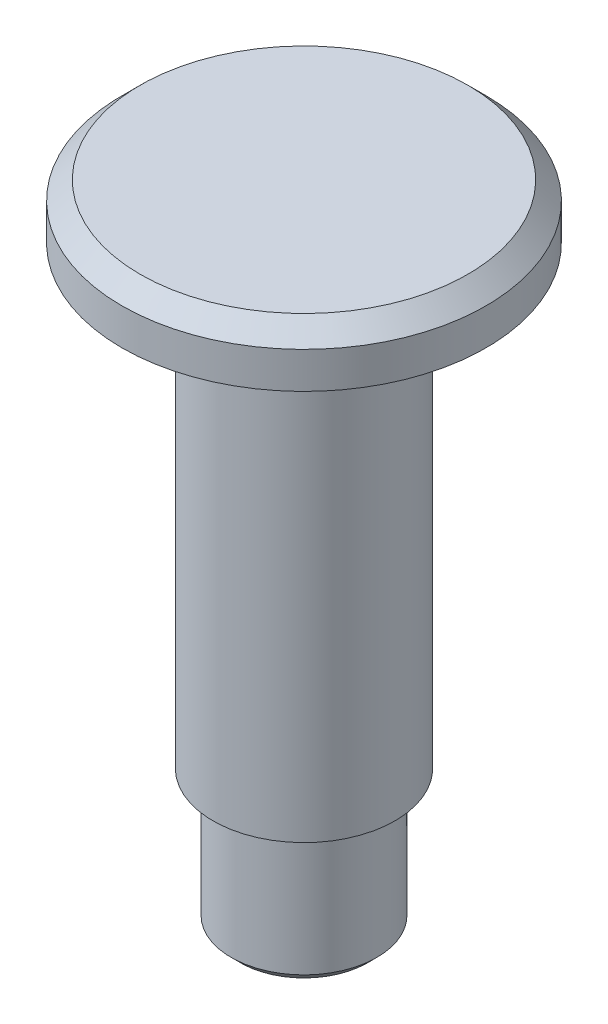
ISO-10303-21;
HEADER;
FILE_DESCRIPTION(('STEP AP214'),'2;1');
FILE_NAME('part.step','',(''),(''),'','','');
FILE_SCHEMA(('AUTOMOTIVE_DESIGN { 1 0 10303 214 1 1 1 1 }'));
ENDSEC;
DATA;
#1=APPLICATION_CONTEXT('core data for automotive mechanical design processes');
#2=APPLICATION_PROTOCOL_DEFINITION('international standard','automotive_design',2000,#1);
#3=PRODUCT_CONTEXT('',#1,'mechanical');
#4=PRODUCT('Part','Part','',(#3));
#5=PRODUCT_RELATED_PRODUCT_CATEGORY('part','',(#4));
#6=PRODUCT_DEFINITION_FORMATION('','',#4);
#7=PRODUCT_DEFINITION_CONTEXT('part definition',#1,'design');
#8=PRODUCT_DEFINITION('design','',#6,#7);
#9=PRODUCT_DEFINITION_SHAPE('','',#8);
#10=(LENGTH_UNIT() NAMED_UNIT(*) SI_UNIT(.MILLI.,.METRE.));
#11=(NAMED_UNIT(*) PLANE_ANGLE_UNIT() SI_UNIT($,.RADIAN.));
#12=(NAMED_UNIT(*) SI_UNIT($,.STERADIAN.) SOLID_ANGLE_UNIT());
#13=UNCERTAINTY_MEASURE_WITH_UNIT(LENGTH_MEASURE(1.E-05),#10,'distance_accuracy_value','');
#14=(GEOMETRIC_REPRESENTATION_CONTEXT(3) GLOBAL_UNCERTAINTY_ASSIGNED_CONTEXT((#13)) GLOBAL_UNIT_ASSIGNED_CONTEXT((#10,
#11,#12)) REPRESENTATION_CONTEXT('',''));
#15=CARTESIAN_POINT('',(0.,0.,0.));
#16=DIRECTION('',(0.,0.,1.));
#17=DIRECTION('',(1.,0.,0.));
#18=AXIS2_PLACEMENT_3D('',#15,#16,#17);
#19=CARTESIAN_POINT('',(0.,0.,0.));
#20=DIRECTION('',(0.,-1.,0.));
#21=DIRECTION('',(0.,0.,-1.));
#22=AXIS2_PLACEMENT_3D('',#19,#20,#21);
#23=PLANE('',#22);
#24=CARTESIAN_POINT('',(0.,0.,0.));
#25=DIRECTION('',(0.,-1.,0.));
#26=DIRECTION('',(0.,0.,-1.));
#27=AXIS2_PLACEMENT_3D('',#24,#25,#26);
#28=CIRCLE('',#27,3.50000000000001);
#29=CARTESIAN_POINT('',(0.,0.,-3.50000000000001));
#30=VERTEX_POINT('',#29);
#31=EDGE_CURVE('E10',#30,#30,#28,.T.);
#32=ORIENTED_EDGE('',*,*,#31,.T.);
#33=EDGE_LOOP('',(#32));
#34=FACE_BOUND('',#33,.T.);
#35=ADVANCED_FACE('F33',(#34),#23,.T.);
#36=CARTESIAN_POINT('',(0.,0.,0.));
#37=DIRECTION('',(0.,1.,0.));
#38=DIRECTION('',(0.,0.,1.));
#39=AXIS2_PLACEMENT_3D('',#36,#37,#38);
#40=CONICAL_SURFACE('',#39,3.50000000000001,0.785398163397448);
#41=CARTESIAN_POINT('',(0.,0.500000000001055,0.));
#42=DIRECTION('',(0.,-1.,0.));
#43=DIRECTION('',(0.,0.,-1.));
#44=AXIS2_PLACEMENT_3D('',#41,#42,#43);
#45=CIRCLE('',#44,4.00000000000001);
#46=CARTESIAN_POINT('',(0.,0.500000000001055,-4.00000000000001));
#47=VERTEX_POINT('',#46);
#48=EDGE_CURVE('E39',#47,#47,#45,.T.);
#49=ORIENTED_EDGE('',*,*,#48,.T.);
#50=EDGE_LOOP('',(#49));
#51=FACE_BOUND('',#50,.T.);
#52=ORIENTED_EDGE('',*,*,#31,.F.);
#53=EDGE_LOOP('',(#52));
#54=FACE_BOUND('',#53,.T.);
#55=ADVANCED_FACE('F83',(#51,#54),#40,.T.);
#56=CARTESIAN_POINT('',(0.,0.,0.));
#57=DIRECTION('',(0.,-1.,0.));
#58=DIRECTION('',(0.,0.,-1.));
#59=AXIS2_PLACEMENT_3D('',#56,#57,#58);
#60=CYLINDRICAL_SURFACE('',#59,4.00000000000001);
#61=CARTESIAN_POINT('',(-1.16573417585641E-12,7.49999999999995,-3.10862446895044E-12));
#62=DIRECTION('',(0.,-1.,0.));
#63=DIRECTION('',(0.,0.,-1.));
#64=AXIS2_PLACEMENT_3D('',#61,#62,#63);
#65=CIRCLE('',#64,4.00000000000001);
#66=CARTESIAN_POINT('',(-1.16645582082242E-12,7.49999999999995,-4.00000000000313));
#67=VERTEX_POINT('',#66);
#68=EDGE_CURVE('E43',#67,#67,#65,.T.);
#69=ORIENTED_EDGE('',*,*,#68,.T.);
#70=EDGE_LOOP('',(#69));
#71=FACE_BOUND('',#70,.T.);
#72=ORIENTED_EDGE('',*,*,#48,.F.);
#73=EDGE_LOOP('',(#72));
#74=FACE_BOUND('',#73,.T.);
#75=ADVANCED_FACE('F87',(#71,#74),#60,.T.);
#76=CARTESIAN_POINT('',(-1.16573417585641E-12,7.49999999999995,-3.10862446895044E-12));
#77=DIRECTION('',(0.,-1.,0.));
#78=DIRECTION('',(0.,0.,-1.));
#79=AXIS2_PLACEMENT_3D('',#76,#77,#78);
#80=TOROIDAL_SURFACE('',#79,4.30000000000001,0.3);
#81=CARTESIAN_POINT('',(-1.16573417585641E-12,7.49999999999995,-3.10862446895044E-12));
#82=DIRECTION('',(0.,-1.,0.));
#83=DIRECTION('',(0.,0.,-1.));
#84=AXIS2_PLACEMENT_3D('',#81,#82,#83);
#85=CIRCLE('',#84,4.60000000000001);
#86=CARTESIAN_POINT('',(-1.16656406756732E-12,7.49999999999995,-4.60000000000313));
#87=VERTEX_POINT('',#86);
#88=EDGE_CURVE('E47',#87,#87,#85,.T.);
#89=ORIENTED_EDGE('',*,*,#88,.T.);
#90=EDGE_LOOP('',(#89));
#91=FACE_BOUND('',#90,.T.);
#92=ORIENTED_EDGE('',*,*,#68,.F.);
#93=EDGE_LOOP('',(#92));
#94=FACE_BOUND('',#93,.T.);
#95=ADVANCED_FACE('F91',(#91,#94),#80,.F.);
#96=CARTESIAN_POINT('',(4.99999999999995,7.50000000000006,0.));
#97=DIRECTION('',(0.,-1.,0.));
#98=DIRECTION('',(0.,0.,-1.));
#99=AXIS2_PLACEMENT_3D('',#96,#97,#98);
#100=PLANE('',#99);
#101=CARTESIAN_POINT('',(-1.16573417585641E-12,7.49999999999995,-3.10862446895044E-12));
#102=DIRECTION('',(0.,-1.,0.));
#103=DIRECTION('',(0.,0.,-1.));
#104=AXIS2_PLACEMENT_3D('',#101,#102,#103);
#105=CIRCLE('',#104,5.);
#106=CARTESIAN_POINT('',(-1.16663623206392E-12,7.49999999999995,-5.00000000000312));
#107=VERTEX_POINT('',#106);
#108=EDGE_CURVE('E52',#107,#107,#105,.T.);
#109=ORIENTED_EDGE('',*,*,#108,.T.);
#110=EDGE_LOOP('',(#109));
#111=FACE_BOUND('',#110,.T.);
#112=ORIENTED_EDGE('',*,*,#88,.F.);
#113=EDGE_LOOP('',(#112));
#114=FACE_BOUND('',#113,.T.);
#115=ADVANCED_FACE('F98',(#111,#114),#100,.T.);
#116=CARTESIAN_POINT('',(0.,0.,0.));
#117=DIRECTION('',(0.,-1.,0.));
#118=DIRECTION('',(0.,0.,-1.));
#119=AXIS2_PLACEMENT_3D('',#116,#117,#118);
#120=CYLINDRICAL_SURFACE('',#119,5.);
#121=CARTESIAN_POINT('',(-9.99200722162641E-13,32.5000000000011,-1.33226762955019E-12));
#122=DIRECTION('',(0.,-1.,0.));
#123=DIRECTION('',(0.,0.,-1.));
#124=AXIS2_PLACEMENT_3D('',#121,#122,#123);
#125=CIRCLE('',#124,5.);
#126=CARTESIAN_POINT('',(-1.00010277837015E-12,32.5000000000011,-5.00000000000134));
#127=VERTEX_POINT('',#126);
#128=EDGE_CURVE('E55',#127,#127,#125,.T.);
#129=ORIENTED_EDGE('',*,*,#128,.T.);
#130=EDGE_LOOP('',(#129));
#131=FACE_BOUND('',#130,.T.);
#132=ORIENTED_EDGE('',*,*,#108,.F.);
#133=EDGE_LOOP('',(#132));
#134=FACE_BOUND('',#133,.T.);
#135=ADVANCED_FACE('F102',(#131,#134),#120,.T.);
#136=CARTESIAN_POINT('',(-9.99200722162641E-13,32.5000000000011,-1.33226762955019E-12));
#137=DIRECTION('',(0.,-1.,0.));
#138=DIRECTION('',(0.,0.,-1.));
#139=AXIS2_PLACEMENT_3D('',#136,#137,#138);
#140=TOROIDAL_SURFACE('',#139,5.3,0.3);
#141=CARTESIAN_POINT('',(-9.99200722162641E-13,32.5000000000011,-1.33226762955019E-12));
#142=DIRECTION('',(0.,-1.,0.));
#143=DIRECTION('',(0.,0.,-1.));
#144=AXIS2_PLACEMENT_3D('',#141,#142,#143);
#145=CIRCLE('',#144,5.6);
#146=CARTESIAN_POINT('',(-1.00021102511505E-12,32.5000000000011,-5.60000000000134));
#147=VERTEX_POINT('',#146);
#148=EDGE_CURVE('E58',#147,#147,#145,.T.);
#149=ORIENTED_EDGE('',*,*,#148,.T.);
#150=EDGE_LOOP('',(#149));
#151=FACE_BOUND('',#150,.T.);
#152=ORIENTED_EDGE('',*,*,#128,.F.);
#153=EDGE_LOOP('',(#152));
#154=FACE_BOUND('',#153,.T.);
#155=ADVANCED_FACE('F106',(#151,#154),#140,.F.);
#156=CARTESIAN_POINT('',(5.59999999999961,32.5000000000011,-8.88178419700125E-13));
#157=DIRECTION('',(0.,-1.,0.));
#158=DIRECTION('',(0.,0.,-1.));
#159=AXIS2_PLACEMENT_3D('',#156,#157,#158);
#160=PLANE('',#159);
#161=CARTESIAN_POINT('',(-9.99200722162641E-13,32.5000000000011,-1.33226762955019E-12));
#162=DIRECTION('',(0.,-1.,0.));
#163=DIRECTION('',(0.,0.,-1.));
#164=AXIS2_PLACEMENT_3D('',#161,#162,#163);
#165=CIRCLE('',#164,10.);
#166=CARTESIAN_POINT('',(-1.00100483457766E-12,32.5000000000011,-10.0000000000014));
#167=VERTEX_POINT('',#166);
#168=EDGE_CURVE('E61',#167,#167,#165,.T.);
#169=ORIENTED_EDGE('',*,*,#168,.T.);
#170=EDGE_LOOP('',(#169));
#171=FACE_BOUND('',#170,.T.);
#172=ORIENTED_EDGE('',*,*,#148,.F.);
#173=EDGE_LOOP('',(#172));
#174=FACE_BOUND('',#173,.T.);
#175=ADVANCED_FACE('F110',(#171,#174),#160,.T.);
#176=CARTESIAN_POINT('',(0.,0.,0.));
#177=DIRECTION('',(0.,-1.,0.));
#178=DIRECTION('',(0.,0.,-1.));
#179=AXIS2_PLACEMENT_3D('',#176,#177,#178);
#180=CYLINDRICAL_SURFACE('',#179,10.);
#181=CARTESIAN_POINT('',(-7.7715611723761E-13,34.5,-3.10862446895044E-12));
#182=DIRECTION('',(0.,-1.,0.));
#183=DIRECTION('',(0.,0.,-1.));
#184=AXIS2_PLACEMENT_3D('',#181,#182,#183);
#185=CIRCLE('',#184,10.);
#186=CARTESIAN_POINT('',(-7.78960229652625E-13,34.5,-10.0000000000031));
#187=VERTEX_POINT('',#186);
#188=EDGE_CURVE('E64',#187,#187,#185,.T.);
#189=ORIENTED_EDGE('',*,*,#188,.T.);
#190=EDGE_LOOP('',(#189));
#191=FACE_BOUND('',#190,.T.);
#192=ORIENTED_EDGE('',*,*,#168,.F.);
#193=EDGE_LOOP('',(#192));
#194=FACE_BOUND('',#193,.T.);
#195=ADVANCED_FACE('F80',(#191,#194),#180,.T.);
#196=CARTESIAN_POINT('',(-7.7715611723761E-13,34.5,-3.10862446895044E-12));
#197=DIRECTION('',(0.,-1.,0.));
#198=DIRECTION('',(0.,0.,-1.));
#199=AXIS2_PLACEMENT_3D('',#196,#197,#198);
#200=CONICAL_SURFACE('',#199,10.,0.785398163397448);
#201=CARTESIAN_POINT('',(-1.38777878078145E-12,35.5000000000011,-2.22044604925031E-12));
#202=DIRECTION('',(0.,-1.,0.));
#203=DIRECTION('',(0.,0.,-1.));
#204=AXIS2_PLACEMENT_3D('',#201,#202,#203);
#205=CIRCLE('',#204,9.);
#206=CARTESIAN_POINT('',(-1.38940248195496E-12,35.5000000000011,-9.00000000000223));
#207=VERTEX_POINT('',#206);
#208=EDGE_CURVE('E67',#207,#207,#205,.T.);
#209=ORIENTED_EDGE('',*,*,#208,.T.);
#210=EDGE_LOOP('',(#209));
#211=FACE_BOUND('',#210,.T.);
#212=ORIENTED_EDGE('',*,*,#188,.F.);
#213=EDGE_LOOP('',(#212));
#214=FACE_BOUND('',#213,.T.);
#215=ADVANCED_FACE('F71',(#211,#214),#200,.T.);
#216=CARTESIAN_POINT('',(8.9999999999989,35.5,0.));
#217=DIRECTION('',(0.,1.,0.));
#218=DIRECTION('',(0.,0.,1.));
#219=AXIS2_PLACEMENT_3D('',#216,#217,#218);
#220=PLANE('',#219);
#221=ORIENTED_EDGE('',*,*,#208,.F.);
#222=EDGE_LOOP('',(#221));
#223=FACE_BOUND('',#222,.T.);
#224=ADVANCED_FACE('F74',(#223),#220,.T.);
#225=CLOSED_SHELL('',(#35,#55,#75,#95,#115,#135,#155,#175,#195,#215,#224));
#226=MANIFOLD_SOLID_BREP('B2',#225);
#227=ADVANCED_BREP_SHAPE_REPRESENTATION('',(#18,#226),#14);
#228=SHAPE_DEFINITION_REPRESENTATION(#9,#227);
ENDSEC;
END-ISO-10303-21;
